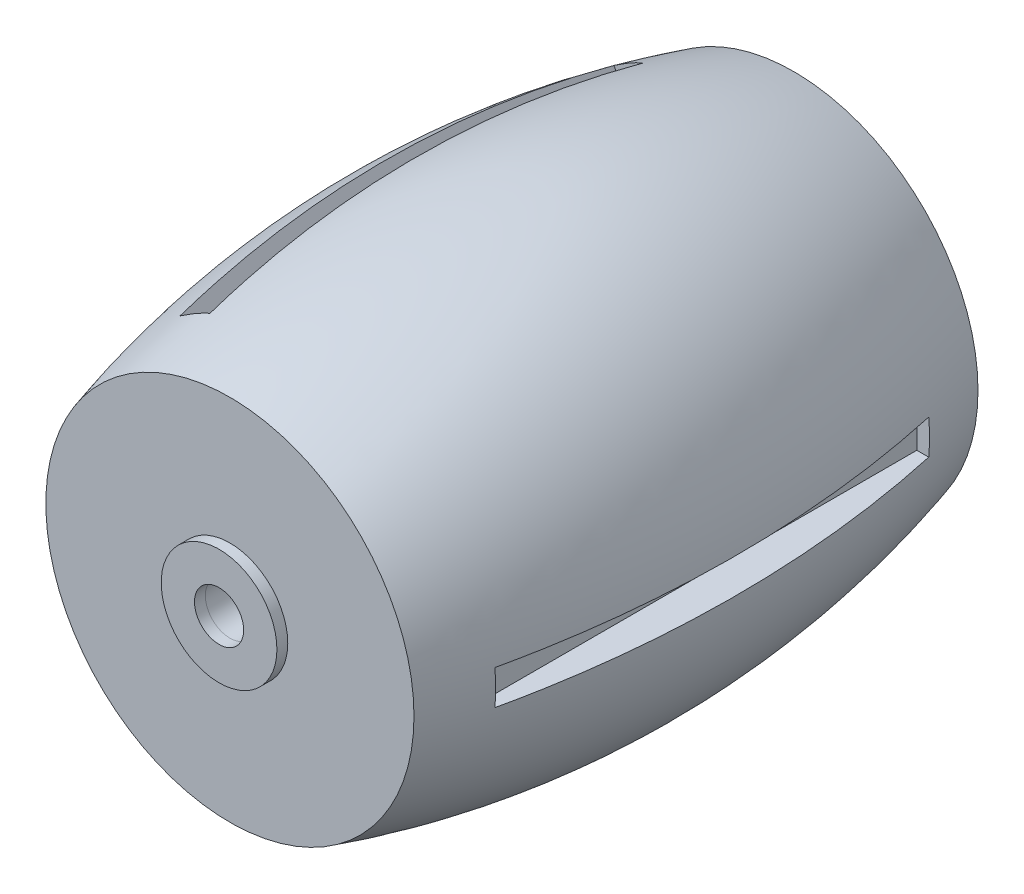
ISO-10303-21;
HEADER;
FILE_DESCRIPTION(('STEP AP214'),'2;1');
FILE_NAME('part.step','',(''),(''),'','','');
FILE_SCHEMA(('AUTOMOTIVE_DESIGN { 1 0 10303 214 1 1 1 1 }'));
ENDSEC;
DATA;
#1=APPLICATION_CONTEXT('core data for automotive mechanical design processes');
#2=APPLICATION_PROTOCOL_DEFINITION('international standard','automotive_design',2000,#1);
#3=PRODUCT_CONTEXT('',#1,'mechanical');
#4=PRODUCT('Part','Part','',(#3));
#5=PRODUCT_RELATED_PRODUCT_CATEGORY('part','',(#4));
#6=PRODUCT_DEFINITION_FORMATION('','',#4);
#7=PRODUCT_DEFINITION_CONTEXT('part definition',#1,'design');
#8=PRODUCT_DEFINITION('design','',#6,#7);
#9=PRODUCT_DEFINITION_SHAPE('','',#8);
#10=(LENGTH_UNIT() NAMED_UNIT(*) SI_UNIT(.MILLI.,.METRE.));
#11=(NAMED_UNIT(*) PLANE_ANGLE_UNIT() SI_UNIT($,.RADIAN.));
#12=(NAMED_UNIT(*) SI_UNIT($,.STERADIAN.) SOLID_ANGLE_UNIT());
#13=UNCERTAINTY_MEASURE_WITH_UNIT(LENGTH_MEASURE(1.E-05),#10,'distance_accuracy_value','');
#14=(GEOMETRIC_REPRESENTATION_CONTEXT(3) GLOBAL_UNCERTAINTY_ASSIGNED_CONTEXT((#13)) GLOBAL_UNIT_ASSIGNED_CONTEXT((#10,
#11,#12)) REPRESENTATION_CONTEXT('',''));
#15=CARTESIAN_POINT('',(0.,0.,0.));
#16=DIRECTION('',(0.,0.,1.));
#17=DIRECTION('',(1.,0.,0.));
#18=AXIS2_PLACEMENT_3D('',#15,#16,#17);
#19=CARTESIAN_POINT('',(0.,0.,19.));
#20=DIRECTION('',(0.,0.,1.));
#21=DIRECTION('',(1.,0.,0.));
#22=AXIS2_PLACEMENT_3D('',#19,#20,#21);
#23=CYLINDRICAL_SURFACE('',#22,1.7);
#24=DIRECTION('',(0.,0.,1.));
#25=VECTOR('',#24,1.);
#26=CARTESIAN_POINT('',(1.7,0.,19.));
#27=LINE('',#26,#25);
#28=CARTESIAN_POINT('',(1.7,0.,19.5));
#29=VERTEX_POINT('',#28);
#30=CARTESIAN_POINT('',(1.7,0.,20.25));
#31=VERTEX_POINT('',#30);
#32=EDGE_CURVE('E9',#29,#31,#27,.T.);
#33=ORIENTED_EDGE('',*,*,#32,.F.);
#34=CARTESIAN_POINT('',(0.,0.,19.5));
#35=DIRECTION('',(0.,0.,1.));
#36=DIRECTION('',(1.,0.,0.));
#37=AXIS2_PLACEMENT_3D('',#34,#35,#36);
#38=CIRCLE('',#37,1.7);
#39=EDGE_CURVE('E263',#29,#29,#38,.T.);
#40=ORIENTED_EDGE('',*,*,#39,.F.);
#41=ORIENTED_EDGE('',*,*,#32,.T.);
#42=CARTESIAN_POINT('',(0.,0.,20.25));
#43=DIRECTION('',(0.,0.,1.));
#44=DIRECTION('',(1.,0.,0.));
#45=AXIS2_PLACEMENT_3D('',#42,#43,#44);
#46=CIRCLE('',#45,1.7);
#47=EDGE_CURVE('E385',#31,#31,#46,.T.);
#48=ORIENTED_EDGE('',*,*,#47,.T.);
#49=EDGE_LOOP('',(#33,#40,#41,#48));
#50=FACE_BOUND('',#49,.T.);
#51=ADVANCED_FACE('F14',(#50),#23,.F.);
#52=CARTESIAN_POINT('',(0.,0.,19.5));
#53=DIRECTION('',(0.,0.,-1.));
#54=DIRECTION('',(1.,0.,0.));
#55=AXIS2_PLACEMENT_3D('',#52,#53,#54);
#56=CYLINDRICAL_SURFACE('',#55,1.7);
#57=ORIENTED_EDGE('',*,*,#39,.T.);
#58=DIRECTION('',(0.,0.,-1.));
#59=VECTOR('',#58,1.);
#60=CARTESIAN_POINT('',(1.7,0.,19.5));
#61=LINE('',#60,#59);
#62=CARTESIAN_POINT('',(1.7,0.,-19.5));
#63=VERTEX_POINT('',#62);
#64=EDGE_CURVE('E27',#29,#63,#61,.T.);
#65=ORIENTED_EDGE('',*,*,#64,.T.);
#66=CARTESIAN_POINT('',(0.,0.,-19.5));
#67=DIRECTION('',(0.,0.,1.));
#68=DIRECTION('',(1.,0.,0.));
#69=AXIS2_PLACEMENT_3D('',#66,#67,#68);
#70=CIRCLE('',#69,1.7);
#71=EDGE_CURVE('E268',#63,#63,#70,.T.);
#72=ORIENTED_EDGE('',*,*,#71,.F.);
#73=ORIENTED_EDGE('',*,*,#64,.F.);
#74=EDGE_LOOP('',(#57,#65,#72,#73));
#75=FACE_BOUND('',#74,.T.);
#76=ADVANCED_FACE('F460',(#75),#56,.F.);
#77=CARTESIAN_POINT('',(0.,0.,20.25));
#78=DIRECTION('',(0.,0.,1.));
#79=DIRECTION('',(1.,0.,0.));
#80=AXIS2_PLACEMENT_3D('',#77,#78,#79);
#81=PLANE('',#80);
#82=ORIENTED_EDGE('',*,*,#47,.F.);
#83=EDGE_LOOP('',(#82));
#84=FACE_BOUND('',#83,.T.);
#85=CARTESIAN_POINT('',(0.,0.,20.25));
#86=DIRECTION('',(0.,0.,1.));
#87=DIRECTION('',(1.,0.,0.));
#88=AXIS2_PLACEMENT_3D('',#85,#86,#87);
#89=CIRCLE('',#88,4.);
#90=CARTESIAN_POINT('',(4.,0.,20.25));
#91=VERTEX_POINT('',#90);
#92=EDGE_CURVE('E397',#91,#91,#89,.T.);
#93=ORIENTED_EDGE('',*,*,#92,.T.);
#94=EDGE_LOOP('',(#93));
#95=FACE_BOUND('',#94,.T.);
#96=ADVANCED_FACE('F463',(#84,#95),#81,.T.);
#97=CARTESIAN_POINT('',(0.,0.,-20.75));
#98=DIRECTION('',(0.,0.,1.));
#99=DIRECTION('',(1.,0.,0.));
#100=AXIS2_PLACEMENT_3D('',#97,#98,#99);
#101=CYLINDRICAL_SURFACE('',#100,1.7);
#102=DIRECTION('',(0.,0.,1.));
#103=VECTOR('',#102,1.);
#104=CARTESIAN_POINT('',(1.7,0.,-20.75));
#105=LINE('',#104,#103);
#106=CARTESIAN_POINT('',(1.7,0.,-20.25));
#107=VERTEX_POINT('',#106);
#108=EDGE_CURVE('E264',#107,#63,#105,.T.);
#109=ORIENTED_EDGE('',*,*,#108,.F.);
#110=CARTESIAN_POINT('',(0.,0.,-20.25));
#111=DIRECTION('',(0.,0.,1.));
#112=DIRECTION('',(1.,0.,0.));
#113=AXIS2_PLACEMENT_3D('',#110,#111,#112);
#114=CIRCLE('',#113,1.7);
#115=EDGE_CURVE('E219',#107,#107,#114,.T.);
#116=ORIENTED_EDGE('',*,*,#115,.F.);
#117=ORIENTED_EDGE('',*,*,#108,.T.);
#118=ORIENTED_EDGE('',*,*,#71,.T.);
#119=EDGE_LOOP('',(#109,#116,#117,#118));
#120=FACE_BOUND('',#119,.T.);
#121=ADVANCED_FACE('F457',(#120),#101,.F.);
#122=CARTESIAN_POINT('',(-7.539230484541,-10.65833024919,-15.));
#123=DIRECTION('',(-0.50000000000019,-0.866025403784329,0.));
#124=DIRECTION('',(-0.866025403784329,0.50000000000019,0.));
#125=AXIS2_PLACEMENT_3D('',#122,#123,#124);
#126=PLANE('',#125);
#127=DIRECTION('',(0.,0.,1.));
#128=VECTOR('',#127,1.);
#129=CARTESIAN_POINT('',(-7.539230484541,-10.65833024919,-15.));
#130=LINE('',#129,#128);
#131=CARTESIAN_POINT('',(-7.539230484541,-10.65833024919,-15.));
#132=VERTEX_POINT('',#131);
#133=CARTESIAN_POINT('',(-7.539230484541,-10.65833024919,15.));
#134=VERTEX_POINT('',#133);
#135=EDGE_CURVE('E214',#132,#134,#130,.T.);
#136=ORIENTED_EDGE('',*,*,#135,.F.);
#137=DIRECTION('',(0.866025403784329,-0.50000000000019,0.));
#138=VECTOR('',#137,1.);
#139=CARTESIAN_POINT('',(-7.539230484541,-10.65833024919,-15.));
#140=LINE('',#139,#138);
#141=CARTESIAN_POINT('',(-5.460769515459,-11.85833024919,-15.));
#142=VERTEX_POINT('',#141);
#143=EDGE_CURVE('E212',#132,#142,#140,.T.);
#144=ORIENTED_EDGE('',*,*,#143,.T.);
#145=DIRECTION('',(0.,0.,1.));
#146=VECTOR('',#145,1.);
#147=CARTESIAN_POINT('',(-5.460769515459,-11.85833024919,-15.));
#148=LINE('',#147,#146);
#149=CARTESIAN_POINT('',(-5.460769515459,-11.85833024919,15.));
#150=VERTEX_POINT('',#149);
#151=EDGE_CURVE('E410',#142,#150,#148,.T.);
#152=ORIENTED_EDGE('',*,*,#151,.T.);
#153=DIRECTION('',(0.866025403784329,-0.50000000000019,0.));
#154=VECTOR('',#153,1.);
#155=CARTESIAN_POINT('',(-7.539230484541,-10.65833024919,15.));
#156=LINE('',#155,#154);
#157=EDGE_CURVE('E220',#134,#150,#156,.T.);
#158=ORIENTED_EDGE('',*,*,#157,.F.);
#159=EDGE_LOOP('',(#136,#144,#152,#158));
#160=FACE_BOUND('',#159,.T.);
#161=ADVANCED_FACE('F481',(#160),#126,.T.);
#162=CARTESIAN_POINT('',(-5.460769515459,11.858330249198,-15.));
#163=DIRECTION('',(-0.50000000000019,0.866025403784329,0.));
#164=DIRECTION('',(0.,0.,1.));
#165=AXIS2_PLACEMENT_3D('',#162,#163,#164);
#166=PLANE('',#165);
#167=DIRECTION('',(0.,0.,1.));
#168=VECTOR('',#167,1.);
#169=CARTESIAN_POINT('',(-5.460769515459,11.858330249198,-15.));
#170=LINE('',#169,#168);
#171=CARTESIAN_POINT('',(-5.460769515459,11.858330249198,-15.));
#172=VERTEX_POINT('',#171);
#173=CARTESIAN_POINT('',(-5.460769515459,11.858330249198,15.));
#174=VERTEX_POINT('',#173);
#175=EDGE_CURVE('E249',#172,#174,#170,.T.);
#176=ORIENTED_EDGE('',*,*,#175,.F.);
#177=DIRECTION('',(-0.866025403784329,-0.50000000000019,0.));
#178=VECTOR('',#177,1.);
#179=CARTESIAN_POINT('',(-5.460769515459,11.858330249198,-15.));
#180=LINE('',#179,#178);
#181=CARTESIAN_POINT('',(-7.539230484541,10.658330249198,-15.));
#182=VERTEX_POINT('',#181);
#183=EDGE_CURVE('E179',#172,#182,#180,.T.);
#184=ORIENTED_EDGE('',*,*,#183,.T.);
#185=DIRECTION('',(0.,0.,1.));
#186=VECTOR('',#185,1.);
#187=CARTESIAN_POINT('',(-7.539230484541,10.658330249198,-15.));
#188=LINE('',#187,#186);
#189=CARTESIAN_POINT('',(-7.539230484541,10.658330249198,15.));
#190=VERTEX_POINT('',#189);
#191=EDGE_CURVE('E223',#182,#190,#188,.T.);
#192=ORIENTED_EDGE('',*,*,#191,.T.);
#193=DIRECTION('',(-0.866025403784329,-0.50000000000019,0.));
#194=VECTOR('',#193,1.);
#195=CARTESIAN_POINT('',(-5.460769515459,11.858330249198,15.));
#196=LINE('',#195,#194);
#197=EDGE_CURVE('E257',#174,#190,#196,.T.);
#198=ORIENTED_EDGE('',*,*,#197,.F.);
#199=EDGE_LOOP('',(#176,#184,#192,#198));
#200=FACE_BOUND('',#199,.T.);
#201=ADVANCED_FACE('F471',(#200),#166,.T.);
#202=CARTESIAN_POINT('',(0.,0.,19.5));
#203=DIRECTION('',(0.,0.,1.));
#204=DIRECTION('',(1.,0.,0.));
#205=AXIS2_PLACEMENT_3D('',#202,#203,#204);
#206=CYLINDRICAL_SURFACE('',#205,4.);
#207=ORIENTED_EDGE('',*,*,#92,.F.);
#208=DIRECTION('',(0.,0.,1.));
#209=VECTOR('',#208,1.);
#210=CARTESIAN_POINT('',(4.,0.,19.5));
#211=LINE('',#210,#209);
#212=CARTESIAN_POINT('',(4.,0.,19.5));
#213=VERTEX_POINT('',#212);
#214=EDGE_CURVE('E269',#213,#91,#211,.T.);
#215=ORIENTED_EDGE('',*,*,#214,.F.);
#216=CARTESIAN_POINT('',(0.,0.,19.5));
#217=DIRECTION('',(0.,0.,1.));
#218=DIRECTION('',(1.,0.,0.));
#219=AXIS2_PLACEMENT_3D('',#216,#217,#218);
#220=CIRCLE('',#219,4.);
#221=EDGE_CURVE('E323',#213,#213,#220,.T.);
#222=ORIENTED_EDGE('',*,*,#221,.T.);
#223=ORIENTED_EDGE('',*,*,#214,.T.);
#224=EDGE_LOOP('',(#207,#215,#222,#223));
#225=FACE_BOUND('',#224,.T.);
#226=ADVANCED_FACE('F468',(#225),#206,.T.);
#227=CARTESIAN_POINT('',(13.,-1.2,-15.));
#228=DIRECTION('',(1.,0.,0.));
#229=DIRECTION('',(0.,1.,0.));
#230=AXIS2_PLACEMENT_3D('',#227,#228,#229);
#231=PLANE('',#230);
#232=DIRECTION('',(0.,0.,1.));
#233=VECTOR('',#232,1.);
#234=CARTESIAN_POINT('',(13.,-1.2,-15.));
#235=LINE('',#234,#233);
#236=CARTESIAN_POINT('',(13.,-1.2,-15.));
#237=VERTEX_POINT('',#236);
#238=CARTESIAN_POINT('',(13.,-1.2,15.));
#239=VERTEX_POINT('',#238);
#240=EDGE_CURVE('E317',#237,#239,#235,.T.);
#241=ORIENTED_EDGE('',*,*,#240,.F.);
#242=DIRECTION('',(0.,1.,0.));
#243=VECTOR('',#242,1.);
#244=CARTESIAN_POINT('',(13.,-1.2,-15.));
#245=LINE('',#244,#243);
#246=CARTESIAN_POINT('',(13.,1.2,-15.));
#247=VERTEX_POINT('',#246);
#248=EDGE_CURVE('E248',#237,#247,#245,.T.);
#249=ORIENTED_EDGE('',*,*,#248,.T.);
#250=DIRECTION('',(0.,0.,1.));
#251=VECTOR('',#250,1.);
#252=CARTESIAN_POINT('',(13.,1.2,-15.));
#253=LINE('',#252,#251);
#254=CARTESIAN_POINT('',(13.,1.2,15.));
#255=VERTEX_POINT('',#254);
#256=EDGE_CURVE('E388',#247,#255,#253,.T.);
#257=ORIENTED_EDGE('',*,*,#256,.T.);
#258=DIRECTION('',(0.,1.,0.));
#259=VECTOR('',#258,1.);
#260=CARTESIAN_POINT('',(13.,-1.2,15.));
#261=LINE('',#260,#259);
#262=EDGE_CURVE('E332',#239,#255,#261,.T.);
#263=ORIENTED_EDGE('',*,*,#262,.F.);
#264=EDGE_LOOP('',(#241,#249,#257,#263));
#265=FACE_BOUND('',#264,.T.);
#266=ADVANCED_FACE('F470',(#265),#231,.T.);
#267=CARTESIAN_POINT('',(0.,0.,-20.25));
#268=DIRECTION('',(0.,0.,1.));
#269=DIRECTION('',(1.,0.,0.));
#270=AXIS2_PLACEMENT_3D('',#267,#268,#269);
#271=PLANE('',#270);
#272=ORIENTED_EDGE('',*,*,#115,.T.);
#273=EDGE_LOOP('',(#272));
#274=FACE_BOUND('',#273,.T.);
#275=CARTESIAN_POINT('',(0.,0.,-20.25));
#276=DIRECTION('',(0.,0.,1.));
#277=DIRECTION('',(1.,0.,0.));
#278=AXIS2_PLACEMENT_3D('',#275,#276,#277);
#279=CIRCLE('',#278,4.);
#280=CARTESIAN_POINT('',(4.,0.,-20.25));
#281=VERTEX_POINT('',#280);
#282=EDGE_CURVE('E272',#281,#281,#279,.T.);
#283=ORIENTED_EDGE('',*,*,#282,.F.);
#284=EDGE_LOOP('',(#283));
#285=FACE_BOUND('',#284,.T.);
#286=ADVANCED_FACE('F478',(#274,#285),#271,.F.);
#287=CARTESIAN_POINT('',(-7.539230484541,-10.65833024919,-15.));
#288=DIRECTION('',(0.866025403784329,-0.50000000000019,0.));
#289=DIRECTION('',(0.,0.,-1.));
#290=AXIS2_PLACEMENT_3D('',#287,#288,#289);
#291=PLANE('',#290);
#292=DIRECTION('',(-0.50000000000019,-0.866025403784329,0.));
#293=VECTOR('',#292,1.);
#294=CARTESIAN_POINT('',(-7.539230484541,-10.65833024919,-15.));
#295=LINE('',#294,#293);
#296=CARTESIAN_POINT('',(-7.950219731899,-11.37018450698,-15.));
#297=VERTEX_POINT('',#296);
#298=EDGE_CURVE('E380',#132,#297,#295,.T.);
#299=ORIENTED_EDGE('',*,*,#298,.F.);
#300=ORIENTED_EDGE('',*,*,#135,.T.);
#301=DIRECTION('',(-0.50000000000019,-0.866025403784329,0.));
#302=VECTOR('',#301,1.);
#303=CARTESIAN_POINT('',(-7.539230484541,-10.65833024919,15.));
#304=LINE('',#303,#302);
#305=CARTESIAN_POINT('',(-7.950219731899,-11.37018450698,15.));
#306=VERTEX_POINT('',#305);
#307=EDGE_CURVE('E407',#134,#306,#304,.T.);
#308=ORIENTED_EDGE('',*,*,#307,.T.);
#309=CARTESIAN_POINT('',(-7.950219731899,-11.37018450698,-15.));
#310=CARTESIAN_POINT('',(-8.221156495105,-11.83946074649,-12.53925340775));
#311=CARTESIAN_POINT('',(-8.438685502025,-12.2162320386,-10.05497421834));
#312=CARTESIAN_POINT('',(-8.60223118536,-12.49950147149,-7.5530053553));
#313=CARTESIAN_POINT('',(-8.711393989596,-12.68857699473,-5.039214245739));
#314=CARTESIAN_POINT('',(-8.765973479018,-12.78311144346,-2.519500470492));
#315=CARTESIAN_POINT('',(-8.765966062664,-12.78309859795,2.519842834098));
#316=CARTESIAN_POINT('',(-8.711382123427,-12.68855644192,5.039487493342));
#317=CARTESIAN_POINT('',(-8.602217852253,-12.49947837787,7.553209327748));
#318=CARTESIAN_POINT('',(-8.438673679286,-12.21621156101,10.055109238417));
#319=CARTESIAN_POINT('',(-8.221149132497,-11.83944799408,12.539320277644));
#320=CARTESIAN_POINT('',(-7.950219731899,-11.37018450698,15.));
#321=(BOUNDED_CURVE() B_SPLINE_CURVE(6,(#309,#310,#311,#312,#313,#314,#315,#316,#317,#318,#319,
#320),.UNSPECIFIED.,.F.,.F.) B_SPLINE_CURVE_WITH_KNOTS((7,5,7),(0.,0.500006793839,1.),
.UNSPECIFIED.) CURVE() GEOMETRIC_REPRESENTATION_ITEM() RATIONAL_B_SPLINE_CURVE((1.,1.,1.,1.,1.,
1.,1.,1.,1.,1.,1.,1.)) REPRESENTATION_ITEM(''));
#322=EDGE_CURVE('E306',#297,#306,#321,.T.);
#323=ORIENTED_EDGE('',*,*,#322,.F.);
#324=EDGE_LOOP('',(#299,#300,#308,#323));
#325=FACE_BOUND('',#324,.T.);
#326=ADVANCED_FACE('F501',(#325),#291,.T.);
#327=CARTESIAN_POINT('',(-7.539230484541,-10.65833024919,15.));
#328=DIRECTION('',(0.,0.,1.));
#329=DIRECTION('',(1.,0.,0.));
#330=AXIS2_PLACEMENT_3D('',#327,#328,#329);
#331=PLANE('',#330);
#332=CARTESIAN_POINT('',(-5.871758762816,-12.57018450698,15.));
#333=CARTESIAN_POINT('',(-6.416054244296,-12.31593431987,15.));
#334=CARTESIAN_POINT('',(-6.945673083775,-12.03025859705,15.));
#335=CARTESIAN_POINT('',(-7.457884772114,-11.71443319614,15.));
#336=CARTESIAN_POINT('',(-7.950219731899,-11.37018450698,15.));
#337=(BOUNDED_CURVE() B_SPLINE_CURVE(4,(#332,#333,#334,#335,#336),.UNSPECIFIED.,.F.,
.F.) B_SPLINE_CURVE_WITH_KNOTS((5,5),(0.,1.),
.UNSPECIFIED.) CURVE() GEOMETRIC_REPRESENTATION_ITEM() RATIONAL_B_SPLINE_CURVE((1.,1.,1.,1.,1.)) REPRESENTATION_ITEM(''));
#338=CARTESIAN_POINT('',(-5.871758762816,-12.57018450698,15.));
#339=VERTEX_POINT('',#338);
#340=EDGE_CURVE('E374',#339,#306,#337,.T.);
#341=ORIENTED_EDGE('',*,*,#340,.T.);
#342=ORIENTED_EDGE('',*,*,#307,.F.);
#343=ORIENTED_EDGE('',*,*,#157,.T.);
#344=DIRECTION('',(-0.50000000000019,-0.866025403784329,0.));
#345=VECTOR('',#344,1.);
#346=CARTESIAN_POINT('',(-5.460769515459,-11.85833024919,15.));
#347=LINE('',#346,#345);
#348=EDGE_CURVE('E384',#150,#339,#347,.T.);
#349=ORIENTED_EDGE('',*,*,#348,.T.);
#350=EDGE_LOOP('',(#341,#342,#343,#349));
#351=FACE_BOUND('',#350,.T.);
#352=ADVANCED_FACE('F497',(#351),#331,.F.);
#353=CARTESIAN_POINT('',(-5.460769515459,-11.85833024919,-15.));
#354=DIRECTION('',(0.866025403784329,-0.50000000000019,0.));
#355=DIRECTION('',(0.,0.,-1.));
#356=AXIS2_PLACEMENT_3D('',#353,#354,#355);
#357=PLANE('',#356);
#358=CARTESIAN_POINT('',(-5.871758762816,-12.57018450698,-15.));
#359=CARTESIAN_POINT('',(-6.142695526022,-13.03946074649,-12.53925340775));
#360=CARTESIAN_POINT('',(-6.360224532942,-13.4162320386,-10.05497421834));
#361=CARTESIAN_POINT('',(-6.523770216277,-13.69950147149,-7.553005355296));
#362=CARTESIAN_POINT('',(-6.632933020514,-13.88857699473,-5.039214245741));
#363=CARTESIAN_POINT('',(-6.687512509935,-13.98311144346,-2.519500470491));
#364=CARTESIAN_POINT('',(-6.687505093581,-13.98309859795,2.519842834099));
#365=CARTESIAN_POINT('',(-6.632921154344,-13.88855644192,5.039487493339));
#366=CARTESIAN_POINT('',(-6.52375688317,-13.69947837787,7.553209327752));
#367=CARTESIAN_POINT('',(-6.360212710203,-13.41621156101,10.055109238415));
#368=CARTESIAN_POINT('',(-6.142688163414,-13.03944799408,12.539320277644));
#369=CARTESIAN_POINT('',(-5.871758762816,-12.57018450698,15.));
#370=(BOUNDED_CURVE() B_SPLINE_CURVE(6,(#358,#359,#360,#361,#362,#363,#364,#365,#366,#367,#368,
#369),.UNSPECIFIED.,.F.,.F.) B_SPLINE_CURVE_WITH_KNOTS((7,5,7),(0.,0.500006793839,1.),
.UNSPECIFIED.) CURVE() GEOMETRIC_REPRESENTATION_ITEM() RATIONAL_B_SPLINE_CURVE((1.,1.,1.,1.,1.,
1.,1.,1.,1.,1.,1.,1.)) REPRESENTATION_ITEM(''));
#371=CARTESIAN_POINT('',(-5.871758762816,-12.57018450698,-15.));
#372=VERTEX_POINT('',#371);
#373=EDGE_CURVE('E365',#372,#339,#370,.T.);
#374=ORIENTED_EDGE('',*,*,#373,.T.);
#375=ORIENTED_EDGE('',*,*,#348,.F.);
#376=ORIENTED_EDGE('',*,*,#151,.F.);
#377=DIRECTION('',(-0.50000000000019,-0.866025403784329,0.));
#378=VECTOR('',#377,1.);
#379=CARTESIAN_POINT('',(-5.460769515459,-11.85833024919,-15.));
#380=LINE('',#379,#378);
#381=EDGE_CURVE('E260',#142,#372,#380,.T.);
#382=ORIENTED_EDGE('',*,*,#381,.T.);
#383=EDGE_LOOP('',(#374,#375,#376,#382));
#384=FACE_BOUND('',#383,.T.);
#385=ADVANCED_FACE('F500',(#384),#357,.F.);
#386=CARTESIAN_POINT('',(-7.539230484541,-10.65833024919,-15.));
#387=DIRECTION('',(0.,0.,1.));
#388=DIRECTION('',(1.,0.,0.));
#389=AXIS2_PLACEMENT_3D('',#386,#387,#388);
#390=PLANE('',#389);
#391=ORIENTED_EDGE('',*,*,#381,.F.);
#392=ORIENTED_EDGE('',*,*,#143,.F.);
#393=ORIENTED_EDGE('',*,*,#298,.T.);
#394=CARTESIAN_POINT('',(-5.871758762816,-12.57018450698,-15.));
#395=CARTESIAN_POINT('',(-6.416054244296,-12.31593431987,-15.));
#396=CARTESIAN_POINT('',(-6.945673083775,-12.03025859705,-15.));
#397=CARTESIAN_POINT('',(-7.457884772114,-11.71443319614,-15.));
#398=CARTESIAN_POINT('',(-7.950219731899,-11.37018450698,-15.));
#399=(BOUNDED_CURVE() B_SPLINE_CURVE(4,(#394,#395,#396,#397,#398),.UNSPECIFIED.,.F.,
.F.) B_SPLINE_CURVE_WITH_KNOTS((5,5),(0.,1.),
.UNSPECIFIED.) CURVE() GEOMETRIC_REPRESENTATION_ITEM() RATIONAL_B_SPLINE_CURVE((1.,1.,1.,1.,1.)) REPRESENTATION_ITEM(''));
#400=EDGE_CURVE('E228',#372,#297,#399,.T.);
#401=ORIENTED_EDGE('',*,*,#400,.F.);
#402=EDGE_LOOP('',(#391,#392,#393,#401));
#403=FACE_BOUND('',#402,.T.);
#404=ADVANCED_FACE('F516',(#403),#390,.T.);
#405=CARTESIAN_POINT('',(-5.460769515459,11.858330249198,15.));
#406=DIRECTION('',(0.,0.,1.));
#407=DIRECTION('',(1.,0.,0.));
#408=AXIS2_PLACEMENT_3D('',#405,#406,#407);
#409=PLANE('',#408);
#410=CARTESIAN_POINT('',(-7.950219731899,11.370184506985,15.));
#411=CARTESIAN_POINT('',(-7.457884772114,11.71443319614,15.));
#412=CARTESIAN_POINT('',(-6.945673083775,12.030258597056,15.));
#413=CARTESIAN_POINT('',(-6.416054244296,12.315934319872,15.));
#414=CARTESIAN_POINT('',(-5.871758762816,12.570184506985,15.));
#415=(BOUNDED_CURVE() B_SPLINE_CURVE(4,(#410,#411,#412,#413,#414),.UNSPECIFIED.,.F.,
.F.) B_SPLINE_CURVE_WITH_KNOTS((5,5),(0.,1.),
.UNSPECIFIED.) CURVE() GEOMETRIC_REPRESENTATION_ITEM() RATIONAL_B_SPLINE_CURVE((1.,1.,1.,1.,1.)) REPRESENTATION_ITEM(''));
#416=CARTESIAN_POINT('',(-7.950219731899,11.370184506985,15.));
#417=VERTEX_POINT('',#416);
#418=CARTESIAN_POINT('',(-5.871758762816,12.570184506985,15.));
#419=VERTEX_POINT('',#418);
#420=EDGE_CURVE('E194',#417,#419,#415,.T.);
#421=ORIENTED_EDGE('',*,*,#420,.T.);
#422=DIRECTION('',(-0.50000000000019,0.866025403784329,0.));
#423=VECTOR('',#422,1.);
#424=CARTESIAN_POINT('',(-5.460769515459,11.858330249198,15.));
#425=LINE('',#424,#423);
#426=EDGE_CURVE('E189',#174,#419,#425,.T.);
#427=ORIENTED_EDGE('',*,*,#426,.F.);
#428=ORIENTED_EDGE('',*,*,#197,.T.);
#429=DIRECTION('',(-0.50000000000019,0.866025403784329,0.));
#430=VECTOR('',#429,1.);
#431=CARTESIAN_POINT('',(-7.539230484541,10.658330249198,15.));
#432=LINE('',#431,#430);
#433=EDGE_CURVE('E183',#190,#417,#432,.T.);
#434=ORIENTED_EDGE('',*,*,#433,.T.);
#435=EDGE_LOOP('',(#421,#427,#428,#434));
#436=FACE_BOUND('',#435,.T.);
#437=ADVANCED_FACE('F514',(#436),#409,.F.);
#438=CARTESIAN_POINT('',(-5.460769515459,11.858330249198,-15.));
#439=DIRECTION('',(-0.866025403784329,-0.50000000000019,0.));
#440=DIRECTION('',(-0.50000000000019,0.866025403784329,0.));
#441=AXIS2_PLACEMENT_3D('',#438,#439,#440);
#442=PLANE('',#441);
#443=DIRECTION('',(-0.50000000000019,0.866025403784329,0.));
#444=VECTOR('',#443,1.);
#445=CARTESIAN_POINT('',(-5.460769515459,11.858330249198,-15.));
#446=LINE('',#445,#444);
#447=CARTESIAN_POINT('',(-5.871758762816,12.570184506985,-15.));
#448=VERTEX_POINT('',#447);
#449=EDGE_CURVE('E172',#172,#448,#446,.T.);
#450=ORIENTED_EDGE('',*,*,#449,.F.);
#451=ORIENTED_EDGE('',*,*,#175,.T.);
#452=ORIENTED_EDGE('',*,*,#426,.T.);
#453=CARTESIAN_POINT('',(-5.871758762816,12.570184506985,-15.));
#454=CARTESIAN_POINT('',(-6.142695526022,13.039460746496,-12.53925340775));
#455=CARTESIAN_POINT('',(-6.360224532943,13.416232038603,-10.05497421834));
#456=CARTESIAN_POINT('',(-6.523770216277,13.699501471496,-7.553005355301));
#457=CARTESIAN_POINT('',(-6.632933020514,13.888576994731,-5.039214245739));
#458=CARTESIAN_POINT('',(-6.687512509935,13.98311144346,-2.519500470492));
#459=CARTESIAN_POINT('',(-6.687505093581,13.983098597958,2.5198428341));
#460=CARTESIAN_POINT('',(-6.632921154344,13.888556441923,5.039487493335));
#461=CARTESIAN_POINT('',(-6.523756883169,13.699478377876,7.55320932776));
#462=CARTESIAN_POINT('',(-6.360212710204,13.416211561019,10.055109238407));
#463=CARTESIAN_POINT('',(-6.142688163414,13.039447994084,12.539320277647));
#464=CARTESIAN_POINT('',(-5.871758762816,12.570184506985,15.));
#465=(BOUNDED_CURVE() B_SPLINE_CURVE(6,(#453,#454,#455,#456,#457,#458,#459,#460,#461,#462,#463,
#464),.UNSPECIFIED.,.F.,.F.) B_SPLINE_CURVE_WITH_KNOTS((7,5,7),(0.,0.500006793839,1.),
.UNSPECIFIED.) CURVE() GEOMETRIC_REPRESENTATION_ITEM() RATIONAL_B_SPLINE_CURVE((1.,1.,1.,1.,1.,
1.,1.,1.,1.,1.,1.,1.)) REPRESENTATION_ITEM(''));
#466=EDGE_CURVE('E186',#448,#419,#465,.T.);
#467=ORIENTED_EDGE('',*,*,#466,.F.);
#468=EDGE_LOOP('',(#450,#451,#452,#467));
#469=FACE_BOUND('',#468,.T.);
#470=ADVANCED_FACE('F187',(#469),#442,.T.);
#471=CARTESIAN_POINT('',(-7.539230484541,10.658330249198,-15.));
#472=DIRECTION('',(-0.866025403784329,-0.50000000000019,0.));
#473=DIRECTION('',(-0.50000000000019,0.866025403784329,0.));
#474=AXIS2_PLACEMENT_3D('',#471,#472,#473);
#475=PLANE('',#474);
#476=CARTESIAN_POINT('',(-7.950219731899,11.370184506985,-15.));
#477=CARTESIAN_POINT('',(-8.221156495105,11.839460746496,-12.53925340775));
#478=CARTESIAN_POINT('',(-8.438685502025,12.216232038602,-10.05497421834));
#479=CARTESIAN_POINT('',(-8.60223118536,12.499501471496,-7.553005355298));
#480=CARTESIAN_POINT('',(-8.711393989596,12.688576994731,-5.03921424574));
#481=CARTESIAN_POINT('',(-8.765973479018,12.78311144346,-2.519500470492));
#482=CARTESIAN_POINT('',(-8.765966062664,12.783098597958,2.519842834098));
#483=CARTESIAN_POINT('',(-8.711382123427,12.688556441922,5.039487493344));
#484=CARTESIAN_POINT('',(-8.602217852253,12.499478377878,7.553209327744));
#485=CARTESIAN_POINT('',(-8.438673679286,12.216211561017,10.05510923842));
#486=CARTESIAN_POINT('',(-8.221149132497,11.839447994085,12.539320277643));
#487=CARTESIAN_POINT('',(-7.950219731899,11.370184506985,15.));
#488=(BOUNDED_CURVE() B_SPLINE_CURVE(6,(#476,#477,#478,#479,#480,#481,#482,#483,#484,#485,#486,
#487),.UNSPECIFIED.,.F.,.F.) B_SPLINE_CURVE_WITH_KNOTS((7,5,7),(0.,0.500006793839,1.),
.UNSPECIFIED.) CURVE() GEOMETRIC_REPRESENTATION_ITEM() RATIONAL_B_SPLINE_CURVE((1.,1.,1.,1.,1.,
1.,1.,1.,1.,1.,1.,1.)) REPRESENTATION_ITEM(''));
#489=CARTESIAN_POINT('',(-7.950219731899,11.370184506985,-15.));
#490=VERTEX_POINT('',#489);
#491=EDGE_CURVE('E198',#490,#417,#488,.T.);
#492=ORIENTED_EDGE('',*,*,#491,.T.);
#493=ORIENTED_EDGE('',*,*,#433,.F.);
#494=ORIENTED_EDGE('',*,*,#191,.F.);
#495=DIRECTION('',(-0.50000000000019,0.866025403784329,0.));
#496=VECTOR('',#495,1.);
#497=CARTESIAN_POINT('',(-7.539230484541,10.658330249198,-15.));
#498=LINE('',#497,#496);
#499=EDGE_CURVE('E322',#182,#490,#498,.T.);
#500=ORIENTED_EDGE('',*,*,#499,.T.);
#501=EDGE_LOOP('',(#492,#493,#494,#500));
#502=FACE_BOUND('',#501,.T.);
#503=ADVANCED_FACE('F509',(#502),#475,.F.);
#504=CARTESIAN_POINT('',(-5.460769515459,11.858330249198,-15.));
#505=DIRECTION('',(0.,0.,1.));
#506=DIRECTION('',(1.,0.,0.));
#507=AXIS2_PLACEMENT_3D('',#504,#505,#506);
#508=PLANE('',#507);
#509=ORIENTED_EDGE('',*,*,#499,.F.);
#510=ORIENTED_EDGE('',*,*,#183,.F.);
#511=ORIENTED_EDGE('',*,*,#449,.T.);
#512=CARTESIAN_POINT('',(-7.950219731899,11.370184506985,-15.));
#513=CARTESIAN_POINT('',(-7.457884772114,11.71443319614,-15.));
#514=CARTESIAN_POINT('',(-6.945673083775,12.030258597056,-15.));
#515=CARTESIAN_POINT('',(-6.416054244296,12.315934319872,-15.));
#516=CARTESIAN_POINT('',(-5.871758762816,12.570184506985,-15.));
#517=(BOUNDED_CURVE() B_SPLINE_CURVE(4,(#512,#513,#514,#515,#516),.UNSPECIFIED.,.F.,
.F.) B_SPLINE_CURVE_WITH_KNOTS((5,5),(0.,1.),
.UNSPECIFIED.) CURVE() GEOMETRIC_REPRESENTATION_ITEM() RATIONAL_B_SPLINE_CURVE((1.,1.,1.,1.,1.)) REPRESENTATION_ITEM(''));
#518=EDGE_CURVE('E177',#490,#448,#517,.T.);
#519=ORIENTED_EDGE('',*,*,#518,.F.);
#520=EDGE_LOOP('',(#509,#510,#511,#519));
#521=FACE_BOUND('',#520,.T.);
#522=ADVANCED_FACE('F175',(#521),#508,.T.);
#523=CARTESIAN_POINT('',(13.,-1.2,-15.));
#524=DIRECTION('',(0.,1.,0.));
#525=DIRECTION('',(1.,0.,0.));
#526=AXIS2_PLACEMENT_3D('',#523,#524,#525);
#527=PLANE('',#526);
#528=DIRECTION('',(1.,0.,0.));
#529=VECTOR('',#528,1.);
#530=CARTESIAN_POINT('',(13.,-1.2,-15.));
#531=LINE('',#530,#529);
#532=CARTESIAN_POINT('',(13.821978494714,-1.2,-15.));
#533=VERTEX_POINT('',#532);
#534=EDGE_CURVE('E240',#237,#533,#531,.T.);
#535=ORIENTED_EDGE('',*,*,#534,.F.);
#536=ORIENTED_EDGE('',*,*,#240,.T.);
#537=DIRECTION('',(1.,0.,0.));
#538=VECTOR('',#537,1.);
#539=CARTESIAN_POINT('',(13.,-1.2,15.));
#540=LINE('',#539,#538);
#541=CARTESIAN_POINT('',(13.821978494714,-1.2,15.));
#542=VERTEX_POINT('',#541);
#543=EDGE_CURVE('E339',#239,#542,#540,.T.);
#544=ORIENTED_EDGE('',*,*,#543,.T.);
#545=CARTESIAN_POINT('',(13.821978494714,-1.2,-15.));
#546=CARTESIAN_POINT('',(14.363852021127,-1.2,-12.53925340774));
#547=CARTESIAN_POINT('',(14.798910034967,-1.2,-10.05497421835));
#548=CARTESIAN_POINT('',(15.126001401637,-1.2,-7.553005355292));
#549=CARTESIAN_POINT('',(15.34432701011,-1.2,-5.039214245745));
#550=CARTESIAN_POINT('',(15.453485988953,-1.2,-2.51950047049));
#551=CARTESIAN_POINT('',(15.453471156245,-1.2,2.5198428341));
#552=CARTESIAN_POINT('',(15.344303277771,-1.2,5.039487493337));
#553=CARTESIAN_POINT('',(15.125974735422,-1.2,7.553209327754));
#554=CARTESIAN_POINT('',(14.79888638949,-1.2,10.055109238412));
#555=CARTESIAN_POINT('',(14.363837295911,-1.2,12.539320277645));
#556=CARTESIAN_POINT('',(13.821978494714,-1.2,15.));
#557=(BOUNDED_CURVE() B_SPLINE_CURVE(6,(#545,#546,#547,#548,#549,#550,#551,#552,#553,#554,#555,
#556),.UNSPECIFIED.,.F.,.F.) B_SPLINE_CURVE_WITH_KNOTS((7,5,7),(0.,0.500006793839,1.),
.UNSPECIFIED.) CURVE() GEOMETRIC_REPRESENTATION_ITEM() RATIONAL_B_SPLINE_CURVE((1.,1.,1.,1.,1.,
1.,1.,1.,1.,1.,1.,1.)) REPRESENTATION_ITEM(''));
#558=EDGE_CURVE('E229',#533,#542,#557,.T.);
#559=ORIENTED_EDGE('',*,*,#558,.F.);
#560=EDGE_LOOP('',(#535,#536,#544,#559));
#561=FACE_BOUND('',#560,.T.);
#562=ADVANCED_FACE('F508',(#561),#527,.T.);
#563=CARTESIAN_POINT('',(0.,0.,19.5));
#564=DIRECTION('',(0.,0.,1.));
#565=DIRECTION('',(1.,0.,0.));
#566=AXIS2_PLACEMENT_3D('',#563,#564,#565);
#567=PLANE('',#566);
#568=ORIENTED_EDGE('',*,*,#221,.F.);
#569=EDGE_LOOP('',(#568));
#570=FACE_BOUND('',#569,.T.);
#571=CARTESIAN_POINT('',(0.,0.,19.5));
#572=DIRECTION('',(0.,0.,1.));
#573=DIRECTION('',(1.,0.,0.));
#574=AXIS2_PLACEMENT_3D('',#571,#572,#573);
#575=CIRCLE('',#574,12.72908596731);
#576=CARTESIAN_POINT('',(12.72908596731,0.,19.5));
#577=VERTEX_POINT('',#576);
#578=EDGE_CURVE('E256',#577,#577,#575,.T.);
#579=ORIENTED_EDGE('',*,*,#578,.T.);
#580=EDGE_LOOP('',(#579));
#581=FACE_BOUND('',#580,.T.);
#582=ADVANCED_FACE('F513',(#570,#581),#567,.T.);
#583=CARTESIAN_POINT('',(13.,-1.2,15.));
#584=DIRECTION('',(0.,0.,1.));
#585=DIRECTION('',(1.,0.,0.));
#586=AXIS2_PLACEMENT_3D('',#583,#584,#585);
#587=PLANE('',#586);
#588=CARTESIAN_POINT('',(13.821978494714,1.2,15.));
#589=CARTESIAN_POINT('',(13.847958815249,0.900750473567,15.));
#590=CARTESIAN_POINT('',(13.865300714606,0.600750630811,15.));
#591=CARTESIAN_POINT('',(13.873971655887,0.30037534093,15.));
#592=CARTESIAN_POINT('',(13.873971655887,0.,15.));
#593=(BOUNDED_CURVE() B_SPLINE_CURVE(4,(#588,#589,#590,#591,#592),.UNSPECIFIED.,.F.,
.F.) B_SPLINE_CURVE_WITH_KNOTS((5,5),(0.,1.),
.UNSPECIFIED.) CURVE() GEOMETRIC_REPRESENTATION_ITEM() RATIONAL_B_SPLINE_CURVE((1.,1.,1.,1.,1.)) REPRESENTATION_ITEM(''));
#594=CARTESIAN_POINT('',(13.821978494714,1.2,15.));
#595=VERTEX_POINT('',#594);
#596=CARTESIAN_POINT('',(13.873971655887,0.,15.));
#597=VERTEX_POINT('',#596);
#598=EDGE_CURVE('E277',#595,#597,#593,.T.);
#599=ORIENTED_EDGE('',*,*,#598,.T.);
#600=CARTESIAN_POINT('',(13.873971655887,0.,15.));
#601=CARTESIAN_POINT('',(13.873971655887,-0.30037534093,15.));
#602=CARTESIAN_POINT('',(13.865300714606,-0.600750630811,15.));
#603=CARTESIAN_POINT('',(13.847958815249,-0.900750473567,15.));
#604=CARTESIAN_POINT('',(13.821978494714,-1.2,15.));
#605=(BOUNDED_CURVE() B_SPLINE_CURVE(4,(#600,#601,#602,#603,#604),.UNSPECIFIED.,.F.,
.F.) B_SPLINE_CURVE_WITH_KNOTS((5,5),(0.,1.),
.UNSPECIFIED.) CURVE() GEOMETRIC_REPRESENTATION_ITEM() RATIONAL_B_SPLINE_CURVE((1.,1.,1.,1.,1.)) REPRESENTATION_ITEM(''));
#606=EDGE_CURVE('E238',#597,#542,#605,.T.);
#607=ORIENTED_EDGE('',*,*,#606,.T.);
#608=ORIENTED_EDGE('',*,*,#543,.F.);
#609=ORIENTED_EDGE('',*,*,#262,.T.);
#610=DIRECTION('',(1.,0.,0.));
#611=VECTOR('',#610,1.);
#612=CARTESIAN_POINT('',(13.,1.2,15.));
#613=LINE('',#612,#611);
#614=EDGE_CURVE('E247',#255,#595,#613,.T.);
#615=ORIENTED_EDGE('',*,*,#614,.T.);
#616=EDGE_LOOP('',(#599,#607,#608,#609,#615));
#617=FACE_BOUND('',#616,.T.);
#618=ADVANCED_FACE('F538',(#617),#587,.F.);
#619=CARTESIAN_POINT('',(13.,1.2,-15.));
#620=DIRECTION('',(0.,1.,0.));
#621=DIRECTION('',(1.,0.,0.));
#622=AXIS2_PLACEMENT_3D('',#619,#620,#621);
#623=PLANE('',#622);
#624=CARTESIAN_POINT('',(13.821978494714,1.2,-15.));
#625=CARTESIAN_POINT('',(14.363852021127,1.2,-12.53925340774));
#626=CARTESIAN_POINT('',(14.798910034967,1.2,-10.05497421835));
#627=CARTESIAN_POINT('',(15.126001401637,1.2,-7.553005355291));
#628=CARTESIAN_POINT('',(15.34432701011,1.2,-5.039214245746));
#629=CARTESIAN_POINT('',(15.453485988953,1.2,-2.51950047049));
#630=CARTESIAN_POINT('',(15.453471156245,1.2,2.519842834103));
#631=CARTESIAN_POINT('',(15.344303277771,1.2,5.039487493328));
#632=CARTESIAN_POINT('',(15.125974735422,1.2,7.553209327765));
#633=CARTESIAN_POINT('',(14.79888638949,1.2,10.055109238407));
#634=CARTESIAN_POINT('',(14.36383729591,1.2,12.539320277646));
#635=CARTESIAN_POINT('',(13.821978494714,1.2,15.));
#636=(BOUNDED_CURVE() B_SPLINE_CURVE(6,(#624,#625,#626,#627,#628,#629,#630,#631,#632,#633,#634,
#635),.UNSPECIFIED.,.F.,.F.) B_SPLINE_CURVE_WITH_KNOTS((7,5,7),(0.,0.500006793838,1.),
.UNSPECIFIED.) CURVE() GEOMETRIC_REPRESENTATION_ITEM() RATIONAL_B_SPLINE_CURVE((1.,1.,1.,1.,1.,
1.,1.,1.,1.,1.,1.,1.)) REPRESENTATION_ITEM(''));
#637=CARTESIAN_POINT('',(13.821978494714,1.2,-15.));
#638=VERTEX_POINT('',#637);
#639=EDGE_CURVE('E206',#638,#595,#636,.T.);
#640=ORIENTED_EDGE('',*,*,#639,.T.);
#641=ORIENTED_EDGE('',*,*,#614,.F.);
#642=ORIENTED_EDGE('',*,*,#256,.F.);
#643=DIRECTION('',(1.,0.,0.));
#644=VECTOR('',#643,1.);
#645=CARTESIAN_POINT('',(13.,1.2,-15.));
#646=LINE('',#645,#644);
#647=EDGE_CURVE('E275',#247,#638,#646,.T.);
#648=ORIENTED_EDGE('',*,*,#647,.T.);
#649=EDGE_LOOP('',(#640,#641,#642,#648));
#650=FACE_BOUND('',#649,.T.);
#651=ADVANCED_FACE('F535',(#650),#623,.F.);
#652=CARTESIAN_POINT('',(13.,-1.2,-15.));
#653=DIRECTION('',(0.,0.,1.));
#654=DIRECTION('',(1.,0.,0.));
#655=AXIS2_PLACEMENT_3D('',#652,#653,#654);
#656=PLANE('',#655);
#657=ORIENTED_EDGE('',*,*,#647,.F.);
#658=ORIENTED_EDGE('',*,*,#248,.F.);
#659=ORIENTED_EDGE('',*,*,#534,.T.);
#660=CARTESIAN_POINT('',(13.873971655887,0.,-15.));
#661=CARTESIAN_POINT('',(13.873971655887,-0.30037534093,-15.));
#662=CARTESIAN_POINT('',(13.865300714606,-0.600750630811,-15.));
#663=CARTESIAN_POINT('',(13.847958815249,-0.900750473567,-15.));
#664=CARTESIAN_POINT('',(13.821978494714,-1.2,-15.));
#665=(BOUNDED_CURVE() B_SPLINE_CURVE(4,(#660,#661,#662,#663,#664),.UNSPECIFIED.,.F.,
.F.) B_SPLINE_CURVE_WITH_KNOTS((5,5),(0.,1.),
.UNSPECIFIED.) CURVE() GEOMETRIC_REPRESENTATION_ITEM() RATIONAL_B_SPLINE_CURVE((1.,1.,1.,1.,1.)) REPRESENTATION_ITEM(''));
#666=CARTESIAN_POINT('',(13.873971655887,0.,-15.));
#667=VERTEX_POINT('',#666);
#668=EDGE_CURVE('E239',#667,#533,#665,.T.);
#669=ORIENTED_EDGE('',*,*,#668,.F.);
#670=CARTESIAN_POINT('',(13.821978494714,1.2,-15.));
#671=CARTESIAN_POINT('',(13.847958815249,0.900750473567,-15.));
#672=CARTESIAN_POINT('',(13.865300714606,0.600750630811,-15.));
#673=CARTESIAN_POINT('',(13.873971655887,0.30037534093,-15.));
#674=CARTESIAN_POINT('',(13.873971655887,0.,-15.));
#675=(BOUNDED_CURVE() B_SPLINE_CURVE(4,(#670,#671,#672,#673,#674),.UNSPECIFIED.,.F.,
.F.) B_SPLINE_CURVE_WITH_KNOTS((5,5),(0.,1.),
.UNSPECIFIED.) CURVE() GEOMETRIC_REPRESENTATION_ITEM() RATIONAL_B_SPLINE_CURVE((1.,1.,1.,1.,1.)) REPRESENTATION_ITEM(''));
#676=EDGE_CURVE('E200',#638,#667,#675,.T.);
#677=ORIENTED_EDGE('',*,*,#676,.F.);
#678=EDGE_LOOP('',(#657,#658,#659,#669,#677));
#679=FACE_BOUND('',#678,.T.);
#680=ADVANCED_FACE('F494',(#679),#656,.T.);
#681=CARTESIAN_POINT('',(0.,0.,-20.25));
#682=DIRECTION('',(0.,0.,1.));
#683=DIRECTION('',(1.,0.,0.));
#684=AXIS2_PLACEMENT_3D('',#681,#682,#683);
#685=CYLINDRICAL_SURFACE('',#684,4.);
#686=CARTESIAN_POINT('',(0.,0.,-19.5));
#687=DIRECTION('',(0.,0.,1.));
#688=DIRECTION('',(1.,0.,0.));
#689=AXIS2_PLACEMENT_3D('',#686,#687,#688);
#690=CIRCLE('',#689,4.);
#691=CARTESIAN_POINT('',(4.,0.,-19.5));
#692=VERTEX_POINT('',#691);
#693=EDGE_CURVE('E313',#692,#692,#690,.T.);
#694=ORIENTED_EDGE('',*,*,#693,.F.);
#695=DIRECTION('',(0.,0.,1.));
#696=VECTOR('',#695,1.);
#697=CARTESIAN_POINT('',(4.,0.,-20.25));
#698=LINE('',#697,#696);
#699=EDGE_CURVE('E276',#281,#692,#698,.T.);
#700=ORIENTED_EDGE('',*,*,#699,.F.);
#701=ORIENTED_EDGE('',*,*,#282,.T.);
#702=ORIENTED_EDGE('',*,*,#699,.T.);
#703=EDGE_LOOP('',(#694,#700,#701,#702));
#704=FACE_BOUND('',#703,.T.);
#705=ADVANCED_FACE('F528',(#704),#685,.T.);
#706=CARTESIAN_POINT('',(12.7290859673199,0.,-19.4999999999671));
#707=CARTESIAN_POINT('',(16.4486731709129,0.,-6.67618216028903));
#708=CARTESIAN_POINT('',(16.4486731709096,0.,6.6761821603239));
#709=CARTESIAN_POINT('',(12.7290859673103,0.,19.5));
#710=(BOUNDED_CURVE() B_SPLINE_CURVE(3,(#706,#707,#708,#709),.UNSPECIFIED.,.F.,
.F.) B_SPLINE_CURVE_WITH_KNOTS((4,4),(0.,1.),
.UNSPECIFIED.) CURVE() GEOMETRIC_REPRESENTATION_ITEM() RATIONAL_B_SPLINE_CURVE((1.,
0.973610342545858,0.973610342545858,1.)) REPRESENTATION_ITEM(''));
#711=CARTESIAN_POINT('',(0.,0.,0.));
#712=DIRECTION('',(0.,0.,-1.));
#713=AXIS1_PLACEMENT('',#711,#712);
#714=SURFACE_OF_REVOLUTION('',#710,#713);
#715=ORIENTED_EDGE('',*,*,#400,.T.);
#716=ORIENTED_EDGE('',*,*,#322,.T.);
#717=ORIENTED_EDGE('',*,*,#340,.F.);
#718=ORIENTED_EDGE('',*,*,#373,.F.);
#719=EDGE_LOOP('',(#715,#716,#717,#718));
#720=FACE_BOUND('',#719,.T.);
#721=ORIENTED_EDGE('',*,*,#518,.T.);
#722=ORIENTED_EDGE('',*,*,#466,.T.);
#723=ORIENTED_EDGE('',*,*,#420,.F.);
#724=ORIENTED_EDGE('',*,*,#491,.F.);
#725=EDGE_LOOP('',(#721,#722,#723,#724));
#726=FACE_BOUND('',#725,.T.);
#727=CARTESIAN_POINT('',(-54.5,0.,0.));
#728=DIRECTION('',(0.,-1.,0.));
#729=DIRECTION('',(0.960415513818855,0.,-0.278571428570958));
#730=AXIS2_PLACEMENT_3D('',#727,#728,#729);
#731=CIRCLE('',#730,70.);
#732=CARTESIAN_POINT('',(12.72908596731,0.,-19.5));
#733=VERTEX_POINT('',#732);
#734=EDGE_CURVE('E346',#733,#667,#731,.T.);
#735=ORIENTED_EDGE('',*,*,#734,.F.);
#736=CARTESIAN_POINT('',(0.,0.,-19.5));
#737=DIRECTION('',(0.,0.,1.));
#738=DIRECTION('',(1.,0.,0.));
#739=AXIS2_PLACEMENT_3D('',#736,#737,#738);
#740=CIRCLE('',#739,12.72908596731);
#741=EDGE_CURVE('E310',#733,#733,#740,.T.);
#742=ORIENTED_EDGE('',*,*,#741,.T.);
#743=ORIENTED_EDGE('',*,*,#734,.T.);
#744=ORIENTED_EDGE('',*,*,#668,.T.);
#745=ORIENTED_EDGE('',*,*,#558,.T.);
#746=ORIENTED_EDGE('',*,*,#606,.F.);
#747=CARTESIAN_POINT('',(-54.5,0.,0.));
#748=DIRECTION('',(0.,-1.,0.));
#749=DIRECTION('',(0.960415513818855,0.,-0.278571428570958));
#750=AXIS2_PLACEMENT_3D('',#747,#748,#749);
#751=CIRCLE('',#750,70.);
#752=EDGE_CURVE('E252',#597,#577,#751,.T.);
#753=ORIENTED_EDGE('',*,*,#752,.T.);
#754=ORIENTED_EDGE('',*,*,#578,.F.);
#755=ORIENTED_EDGE('',*,*,#752,.F.);
#756=ORIENTED_EDGE('',*,*,#598,.F.);
#757=ORIENTED_EDGE('',*,*,#639,.F.);
#758=ORIENTED_EDGE('',*,*,#676,.T.);
#759=EDGE_LOOP('',(#735,#742,#743,#744,#745,#746,#753,#754,#755,#756,#757,#758));
#760=FACE_BOUND('',#759,.T.);
#761=ADVANCED_FACE('F16',(#720,#726,#760),#714,.F.);
#762=CARTESIAN_POINT('',(0.,0.,-19.5));
#763=DIRECTION('',(0.,0.,1.));
#764=DIRECTION('',(1.,0.,0.));
#765=AXIS2_PLACEMENT_3D('',#762,#763,#764);
#766=PLANE('',#765);
#767=ORIENTED_EDGE('',*,*,#693,.T.);
#768=EDGE_LOOP('',(#767));
#769=FACE_BOUND('',#768,.T.);
#770=ORIENTED_EDGE('',*,*,#741,.F.);
#771=EDGE_LOOP('',(#770));
#772=FACE_BOUND('',#771,.T.);
#773=ADVANCED_FACE('F503',(#769,#772),#766,.F.);
#774=CLOSED_SHELL('',(#51,#76,#96,#121,#161,#201,#226,#266,#286,#326,#352,#385,#404,#437,#470,
#503,#522,#562,#582,#618,#651,#680,#705,#761,#773));
#775=MANIFOLD_SOLID_BREP('B1',#774);
#776=ADVANCED_BREP_SHAPE_REPRESENTATION('',(#18,#775),#14);
#777=SHAPE_DEFINITION_REPRESENTATION(#9,#776);
ENDSEC;
END-ISO-10303-21;
